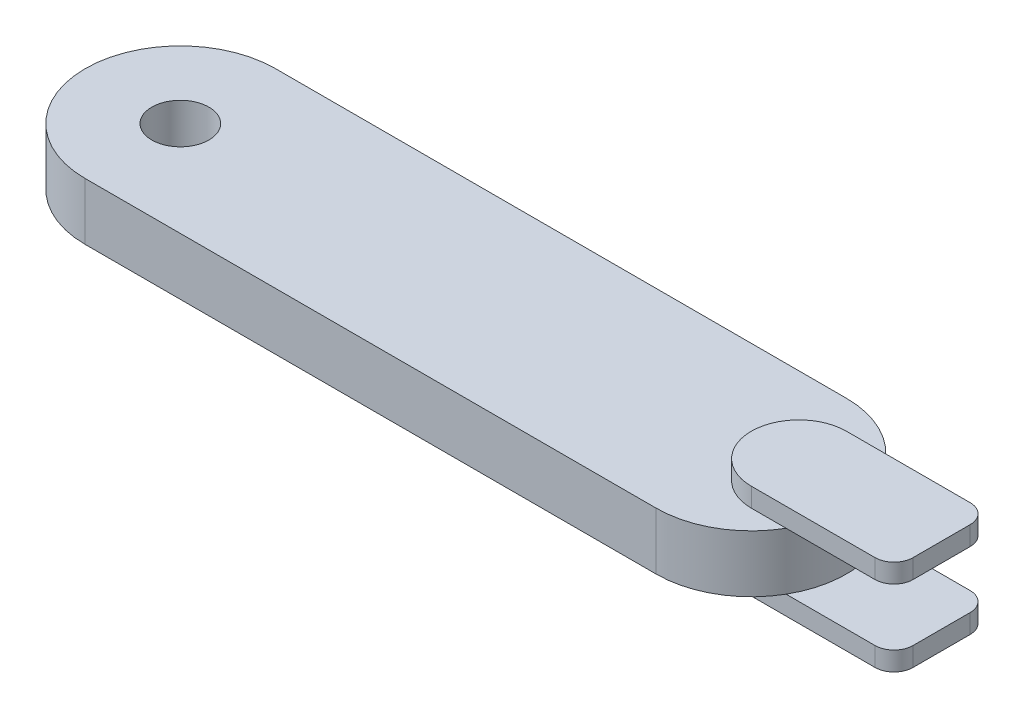
ISO-10303-21;
HEADER;
FILE_DESCRIPTION(('STEP AP214'),'2;1');
FILE_NAME('part.step','',(''),(''),'','','');
FILE_SCHEMA(('AUTOMOTIVE_DESIGN { 1 0 10303 214 1 1 1 1 }'));
ENDSEC;
DATA;
#1=APPLICATION_CONTEXT('core data for automotive mechanical design processes');
#2=APPLICATION_PROTOCOL_DEFINITION('international standard','automotive_design',2000,#1);
#3=PRODUCT_CONTEXT('',#1,'mechanical');
#4=PRODUCT('Part','Part','',(#3));
#5=PRODUCT_RELATED_PRODUCT_CATEGORY('part','',(#4));
#6=PRODUCT_DEFINITION_FORMATION('','',#4);
#7=PRODUCT_DEFINITION_CONTEXT('part definition',#1,'design');
#8=PRODUCT_DEFINITION('design','',#6,#7);
#9=PRODUCT_DEFINITION_SHAPE('','',#8);
#10=(LENGTH_UNIT() NAMED_UNIT(*) SI_UNIT(.MILLI.,.METRE.));
#11=(NAMED_UNIT(*) PLANE_ANGLE_UNIT() SI_UNIT($,.RADIAN.));
#12=(NAMED_UNIT(*) SI_UNIT($,.STERADIAN.) SOLID_ANGLE_UNIT());
#13=UNCERTAINTY_MEASURE_WITH_UNIT(LENGTH_MEASURE(1.E-05),#10,'distance_accuracy_value','');
#14=(GEOMETRIC_REPRESENTATION_CONTEXT(3) GLOBAL_UNCERTAINTY_ASSIGNED_CONTEXT((#13)) GLOBAL_UNIT_ASSIGNED_CONTEXT((#10,
#11,#12)) REPRESENTATION_CONTEXT('',''));
#15=CARTESIAN_POINT('',(0.,0.,0.));
#16=DIRECTION('',(0.,0.,1.));
#17=DIRECTION('',(1.,0.,0.));
#18=AXIS2_PLACEMENT_3D('',#15,#16,#17);
#19=CARTESIAN_POINT('',(0.,3.,0.));
#20=DIRECTION('',(0.,1.,0.));
#21=DIRECTION('',(0.,0.,1.));
#22=AXIS2_PLACEMENT_3D('',#19,#20,#21);
#23=PLANE('',#22);
#24=CARTESIAN_POINT('',(0.,3.,0.));
#25=DIRECTION('',(0.,1.,0.));
#26=DIRECTION('',(0.,0.,1.));
#27=AXIS2_PLACEMENT_3D('',#24,#25,#26);
#28=CIRCLE('',#27,1.5);
#29=CARTESIAN_POINT('',(0.,3.,1.5));
#30=VERTEX_POINT('',#29);
#31=EDGE_CURVE('E356',#30,#30,#28,.T.);
#32=ORIENTED_EDGE('',*,*,#31,.F.);
#33=EDGE_LOOP('',(#32));
#34=FACE_BOUND('',#33,.T.);
#35=DIRECTION('',(1.,0.,0.));
#36=VECTOR('',#35,1.);
#37=CARTESIAN_POINT('',(30.,3.,2.5));
#38=LINE('',#37,#36);
#39=CARTESIAN_POINT('',(32.5,3.,2.5));
#40=VERTEX_POINT('',#39);
#41=CARTESIAN_POINT('',(34.3301270189222,3.,2.5));
#42=VERTEX_POINT('',#41);
#43=EDGE_CURVE('E304',#40,#42,#38,.T.);
#44=ORIENTED_EDGE('',*,*,#43,.F.);
#45=CARTESIAN_POINT('',(32.5,3.,0.));
#46=DIRECTION('',(0.,1.,0.));
#47=DIRECTION('',(0.,0.,1.));
#48=AXIS2_PLACEMENT_3D('',#45,#46,#47);
#49=CIRCLE('',#48,2.5);
#50=CARTESIAN_POINT('',(30.,3.,0.));
#51=VERTEX_POINT('',#50);
#52=EDGE_CURVE('E257',#40,#51,#49,.F.);
#53=ORIENTED_EDGE('',*,*,#52,.T.);
#54=CARTESIAN_POINT('',(32.5,3.,0.));
#55=DIRECTION('',(0.,1.,0.));
#56=DIRECTION('',(0.,0.,1.));
#57=AXIS2_PLACEMENT_3D('',#54,#55,#56);
#58=CIRCLE('',#57,2.5);
#59=CARTESIAN_POINT('',(32.5,3.,-2.5));
#60=VERTEX_POINT('',#59);
#61=EDGE_CURVE('E178',#51,#60,#58,.F.);
#62=ORIENTED_EDGE('',*,*,#61,.T.);
#63=DIRECTION('',(1.,0.,0.));
#64=VECTOR('',#63,1.);
#65=CARTESIAN_POINT('',(30.,3.,-2.5));
#66=LINE('',#65,#64);
#67=CARTESIAN_POINT('',(34.3301270189222,3.,-2.5));
#68=VERTEX_POINT('',#67);
#69=EDGE_CURVE('E171',#60,#68,#66,.T.);
#70=ORIENTED_EDGE('',*,*,#69,.T.);
#71=CARTESIAN_POINT('',(30.,3.,0.));
#72=DIRECTION('',(0.,1.,0.));
#73=DIRECTION('',(0.,0.,1.));
#74=AXIS2_PLACEMENT_3D('',#71,#72,#73);
#75=CIRCLE('',#74,5.);
#76=CARTESIAN_POINT('',(30.,3.,-5.));
#77=VERTEX_POINT('',#76);
#78=EDGE_CURVE('E175',#68,#77,#75,.T.);
#79=ORIENTED_EDGE('',*,*,#78,.T.);
#80=DIRECTION('',(-1.,0.,0.));
#81=VECTOR('',#80,1.);
#82=CARTESIAN_POINT('',(0.,3.,-5.));
#83=LINE('',#82,#81);
#84=CARTESIAN_POINT('',(0.,3.,-5.));
#85=VERTEX_POINT('',#84);
#86=EDGE_CURVE('E206',#77,#85,#83,.T.);
#87=ORIENTED_EDGE('',*,*,#86,.T.);
#88=CARTESIAN_POINT('',(0.,3.,0.));
#89=DIRECTION('',(0.,1.,0.));
#90=DIRECTION('',(0.,0.,1.));
#91=AXIS2_PLACEMENT_3D('',#88,#89,#90);
#92=CIRCLE('',#91,5.);
#93=CARTESIAN_POINT('',(0.,3.,5.));
#94=VERTEX_POINT('',#93);
#95=EDGE_CURVE('E203',#85,#94,#92,.T.);
#96=ORIENTED_EDGE('',*,*,#95,.T.);
#97=DIRECTION('',(1.,0.,0.));
#98=VECTOR('',#97,1.);
#99=CARTESIAN_POINT('',(0.,3.,5.));
#100=LINE('',#99,#98);
#101=CARTESIAN_POINT('',(30.,3.,5.));
#102=VERTEX_POINT('',#101);
#103=EDGE_CURVE('E202',#94,#102,#100,.T.);
#104=ORIENTED_EDGE('',*,*,#103,.T.);
#105=EDGE_CURVE('E193',#102,#42,#75,.T.);
#106=ORIENTED_EDGE('',*,*,#105,.T.);
#107=EDGE_LOOP('',(#44,#53,#62,#70,#79,#87,#96,#104,#106));
#108=FACE_BOUND('',#107,.T.);
#109=ADVANCED_FACE('F33',(#34,#108),#23,.T.);
#110=CARTESIAN_POINT('',(0.,3.,0.));
#111=DIRECTION('',(0.,-1.,0.));
#112=DIRECTION('',(0.,0.,-1.));
#113=AXIS2_PLACEMENT_3D('',#110,#111,#112);
#114=CYLINDRICAL_SURFACE('',#113,5.);
#115=CARTESIAN_POINT('',(0.,0.,0.));
#116=DIRECTION('',(0.,1.,0.));
#117=DIRECTION('',(0.,0.,1.));
#118=AXIS2_PLACEMENT_3D('',#115,#116,#117);
#119=CIRCLE('',#118,5.);
#120=CARTESIAN_POINT('',(0.,0.,-5.));
#121=VERTEX_POINT('',#120);
#122=CARTESIAN_POINT('',(0.,0.,5.));
#123=VERTEX_POINT('',#122);
#124=EDGE_CURVE('E213',#121,#123,#119,.T.);
#125=ORIENTED_EDGE('',*,*,#124,.T.);
#126=DIRECTION('',(0.,-1.,0.));
#127=VECTOR('',#126,1.);
#128=CARTESIAN_POINT('',(0.,3.,5.));
#129=LINE('',#128,#127);
#130=EDGE_CURVE('E229',#94,#123,#129,.T.);
#131=ORIENTED_EDGE('',*,*,#130,.F.);
#132=ORIENTED_EDGE('',*,*,#95,.F.);
#133=DIRECTION('',(0.,-1.,0.));
#134=VECTOR('',#133,1.);
#135=CARTESIAN_POINT('',(0.,3.,-5.));
#136=LINE('',#135,#134);
#137=EDGE_CURVE('E207',#85,#121,#136,.T.);
#138=ORIENTED_EDGE('',*,*,#137,.T.);
#139=EDGE_LOOP('',(#125,#131,#132,#138));
#140=FACE_BOUND('',#139,.T.);
#141=ADVANCED_FACE('F325',(#140),#114,.T.);
#142=CARTESIAN_POINT('',(0.,3.,5.));
#143=DIRECTION('',(0.,0.,-1.));
#144=DIRECTION('',(-1.,0.,0.));
#145=AXIS2_PLACEMENT_3D('',#142,#143,#144);
#146=PLANE('',#145);
#147=DIRECTION('',(1.,0.,0.));
#148=VECTOR('',#147,1.);
#149=CARTESIAN_POINT('',(0.,0.,5.));
#150=LINE('',#149,#148);
#151=CARTESIAN_POINT('',(30.,0.,5.));
#152=VERTEX_POINT('',#151);
#153=EDGE_CURVE('E216',#123,#152,#150,.T.);
#154=ORIENTED_EDGE('',*,*,#153,.T.);
#155=DIRECTION('',(0.,-1.,0.));
#156=VECTOR('',#155,1.);
#157=CARTESIAN_POINT('',(30.,3.,5.));
#158=LINE('',#157,#156);
#159=EDGE_CURVE('E226',#102,#152,#158,.T.);
#160=ORIENTED_EDGE('',*,*,#159,.F.);
#161=ORIENTED_EDGE('',*,*,#103,.F.);
#162=ORIENTED_EDGE('',*,*,#130,.T.);
#163=EDGE_LOOP('',(#154,#160,#161,#162));
#164=FACE_BOUND('',#163,.T.);
#165=ADVANCED_FACE('F328',(#164),#146,.F.);
#166=CARTESIAN_POINT('',(30.,3.,0.));
#167=DIRECTION('',(0.,-1.,0.));
#168=DIRECTION('',(0.,0.,-1.));
#169=AXIS2_PLACEMENT_3D('',#166,#167,#168);
#170=CYLINDRICAL_SURFACE('',#169,5.);
#171=CARTESIAN_POINT('',(30.,0.,0.));
#172=DIRECTION('',(0.,1.,0.));
#173=DIRECTION('',(0.,0.,1.));
#174=AXIS2_PLACEMENT_3D('',#171,#172,#173);
#175=CIRCLE('',#174,5.);
#176=CARTESIAN_POINT('',(34.3301270189222,0.,2.5));
#177=VERTEX_POINT('',#176);
#178=EDGE_CURVE('E220',#152,#177,#175,.T.);
#179=ORIENTED_EDGE('',*,*,#178,.T.);
#180=CARTESIAN_POINT('',(34.3301270189222,0.,-2.5));
#181=VERTEX_POINT('',#180);
#182=EDGE_CURVE('E223',#177,#181,#175,.T.);
#183=ORIENTED_EDGE('',*,*,#182,.T.);
#184=CARTESIAN_POINT('',(30.,0.,-5.));
#185=VERTEX_POINT('',#184);
#186=EDGE_CURVE('E219',#181,#185,#175,.T.);
#187=ORIENTED_EDGE('',*,*,#186,.T.);
#188=DIRECTION('',(0.,-1.,0.));
#189=VECTOR('',#188,1.);
#190=CARTESIAN_POINT('',(30.,3.,-5.));
#191=LINE('',#190,#189);
#192=EDGE_CURVE('E200',#77,#185,#191,.T.);
#193=ORIENTED_EDGE('',*,*,#192,.F.);
#194=ORIENTED_EDGE('',*,*,#78,.F.);
#195=EDGE_CURVE('E186',#42,#68,#75,.T.);
#196=ORIENTED_EDGE('',*,*,#195,.F.);
#197=ORIENTED_EDGE('',*,*,#105,.F.);
#198=ORIENTED_EDGE('',*,*,#159,.T.);
#199=EDGE_LOOP('',(#179,#183,#187,#193,#194,#196,#197,#198));
#200=FACE_BOUND('',#199,.T.);
#201=ADVANCED_FACE('F198',(#200),#170,.T.);
#202=CARTESIAN_POINT('',(0.,3.,-5.));
#203=DIRECTION('',(0.,0.,1.));
#204=DIRECTION('',(1.,0.,0.));
#205=AXIS2_PLACEMENT_3D('',#202,#203,#204);
#206=PLANE('',#205);
#207=DIRECTION('',(-1.,0.,0.));
#208=VECTOR('',#207,1.);
#209=CARTESIAN_POINT('',(0.,0.,-5.));
#210=LINE('',#209,#208);
#211=EDGE_CURVE('E222',#185,#121,#210,.T.);
#212=ORIENTED_EDGE('',*,*,#211,.T.);
#213=ORIENTED_EDGE('',*,*,#137,.F.);
#214=ORIENTED_EDGE('',*,*,#86,.F.);
#215=ORIENTED_EDGE('',*,*,#192,.T.);
#216=EDGE_LOOP('',(#212,#213,#214,#215));
#217=FACE_BOUND('',#216,.T.);
#218=ADVANCED_FACE('F384',(#217),#206,.F.);
#219=CARTESIAN_POINT('',(0.,0.,0.));
#220=DIRECTION('',(0.,1.,0.));
#221=DIRECTION('',(0.,0.,1.));
#222=AXIS2_PLACEMENT_3D('',#219,#220,#221);
#223=PLANE('',#222);
#224=CARTESIAN_POINT('',(0.,0.,0.));
#225=DIRECTION('',(0.,1.,0.));
#226=DIRECTION('',(0.,0.,1.));
#227=AXIS2_PLACEMENT_3D('',#224,#225,#226);
#228=CIRCLE('',#227,1.5);
#229=CARTESIAN_POINT('',(0.,0.,1.5));
#230=VERTEX_POINT('',#229);
#231=EDGE_CURVE('E37',#230,#230,#228,.T.);
#232=ORIENTED_EDGE('',*,*,#231,.T.);
#233=EDGE_LOOP('',(#232));
#234=FACE_BOUND('',#233,.T.);
#235=ORIENTED_EDGE('',*,*,#186,.F.);
#236=DIRECTION('',(-1.,0.,0.));
#237=VECTOR('',#236,1.);
#238=CARTESIAN_POINT('',(30.,0.,-2.5));
#239=LINE('',#238,#237);
#240=CARTESIAN_POINT('',(32.5,0.,-2.5));
#241=VERTEX_POINT('',#240);
#242=EDGE_CURVE('E237',#181,#241,#239,.T.);
#243=ORIENTED_EDGE('',*,*,#242,.T.);
#244=CARTESIAN_POINT('',(32.5,0.,0.));
#245=DIRECTION('',(0.,1.,0.));
#246=DIRECTION('',(0.,0.,1.));
#247=AXIS2_PLACEMENT_3D('',#244,#245,#246);
#248=CIRCLE('',#247,2.5);
#249=CARTESIAN_POINT('',(30.,0.,0.));
#250=VERTEX_POINT('',#249);
#251=EDGE_CURVE('E254',#241,#250,#248,.T.);
#252=ORIENTED_EDGE('',*,*,#251,.T.);
#253=CARTESIAN_POINT('',(32.5,0.,0.));
#254=DIRECTION('',(0.,1.,0.));
#255=DIRECTION('',(0.,0.,1.));
#256=AXIS2_PLACEMENT_3D('',#253,#254,#255);
#257=CIRCLE('',#256,2.5);
#258=CARTESIAN_POINT('',(32.5,0.,2.5));
#259=VERTEX_POINT('',#258);
#260=EDGE_CURVE('E252',#250,#259,#257,.T.);
#261=ORIENTED_EDGE('',*,*,#260,.T.);
#262=DIRECTION('',(-1.,0.,0.));
#263=VECTOR('',#262,1.);
#264=CARTESIAN_POINT('',(30.,0.,2.5));
#265=LINE('',#264,#263);
#266=EDGE_CURVE('E232',#177,#259,#265,.T.);
#267=ORIENTED_EDGE('',*,*,#266,.F.);
#268=ORIENTED_EDGE('',*,*,#178,.F.);
#269=ORIENTED_EDGE('',*,*,#153,.F.);
#270=ORIENTED_EDGE('',*,*,#124,.F.);
#271=ORIENTED_EDGE('',*,*,#211,.F.);
#272=EDGE_LOOP('',(#235,#243,#252,#261,#267,#268,#269,#270,#271));
#273=FACE_BOUND('',#272,.T.);
#274=ADVANCED_FACE('F335',(#234,#273),#223,.F.);
#275=CARTESIAN_POINT('',(30.,3.,2.5));
#276=DIRECTION('',(0.,1.,0.));
#277=DIRECTION('',(0.,0.,1.));
#278=AXIS2_PLACEMENT_3D('',#275,#276,#277);
#279=PLANE('',#278);
#280=DIRECTION('',(0.,0.,-1.));
#281=VECTOR('',#280,1.);
#282=CARTESIAN_POINT('',(40.,3.,2.5));
#283=LINE('',#282,#281);
#284=CARTESIAN_POINT('',(40.,3.,1.5));
#285=VERTEX_POINT('',#284);
#286=CARTESIAN_POINT('',(40.,3.,-1.5));
#287=VERTEX_POINT('',#286);
#288=EDGE_CURVE('E217',#285,#287,#283,.T.);
#289=ORIENTED_EDGE('',*,*,#288,.F.);
#290=CARTESIAN_POINT('',(39.,3.,1.5));
#291=DIRECTION('',(0.,1.,0.));
#292=DIRECTION('',(0.,0.,1.));
#293=AXIS2_PLACEMENT_3D('',#290,#291,#292);
#294=CIRCLE('',#293,1.);
#295=CARTESIAN_POINT('',(39.,3.,2.5));
#296=VERTEX_POINT('',#295);
#297=EDGE_CURVE('E42',#285,#296,#294,.F.);
#298=ORIENTED_EDGE('',*,*,#297,.T.);
#299=EDGE_CURVE('E189',#42,#296,#38,.T.);
#300=ORIENTED_EDGE('',*,*,#299,.F.);
#301=ORIENTED_EDGE('',*,*,#195,.T.);
#302=CARTESIAN_POINT('',(39.,3.,-2.5));
#303=VERTEX_POINT('',#302);
#304=EDGE_CURVE('E182',#68,#303,#66,.T.);
#305=ORIENTED_EDGE('',*,*,#304,.T.);
#306=CARTESIAN_POINT('',(39.,3.,-1.5));
#307=DIRECTION('',(0.,1.,0.));
#308=DIRECTION('',(0.,0.,1.));
#309=AXIS2_PLACEMENT_3D('',#306,#307,#308);
#310=CIRCLE('',#309,1.);
#311=EDGE_CURVE('E54',#303,#287,#310,.F.);
#312=ORIENTED_EDGE('',*,*,#311,.T.);
#313=EDGE_LOOP('',(#289,#298,#300,#301,#305,#312));
#314=FACE_BOUND('',#313,.T.);
#315=ADVANCED_FACE('F187',(#314),#279,.F.);
#316=CARTESIAN_POINT('',(40.,3.,2.5));
#317=DIRECTION('',(-1.,0.,0.));
#318=DIRECTION('',(0.,0.,1.));
#319=AXIS2_PLACEMENT_3D('',#316,#317,#318);
#320=PLANE('',#319);
#321=DIRECTION('',(0.,0.,-1.));
#322=VECTOR('',#321,1.);
#323=CARTESIAN_POINT('',(40.,4.,2.5));
#324=LINE('',#323,#322);
#325=CARTESIAN_POINT('',(40.,4.,1.5));
#326=VERTEX_POINT('',#325);
#327=CARTESIAN_POINT('',(40.,4.,-1.5));
#328=VERTEX_POINT('',#327);
#329=EDGE_CURVE('E311',#326,#328,#324,.T.);
#330=ORIENTED_EDGE('',*,*,#329,.F.);
#331=DIRECTION('',(0.,1.,0.));
#332=VECTOR('',#331,1.);
#333=CARTESIAN_POINT('',(40.,3.,1.5));
#334=LINE('',#333,#332);
#335=EDGE_CURVE('E294',#326,#285,#334,.F.);
#336=ORIENTED_EDGE('',*,*,#335,.T.);
#337=ORIENTED_EDGE('',*,*,#288,.T.);
#338=DIRECTION('',(0.,1.,0.));
#339=VECTOR('',#338,1.);
#340=CARTESIAN_POINT('',(40.,4.,-1.5));
#341=LINE('',#340,#339);
#342=EDGE_CURVE('E291',#287,#328,#341,.T.);
#343=ORIENTED_EDGE('',*,*,#342,.T.);
#344=EDGE_LOOP('',(#330,#336,#337,#343));
#345=FACE_BOUND('',#344,.T.);
#346=ADVANCED_FACE('F314',(#345),#320,.F.);
#347=CARTESIAN_POINT('',(30.,4.,2.5));
#348=DIRECTION('',(0.,-1.,0.));
#349=DIRECTION('',(0.,0.,-1.));
#350=AXIS2_PLACEMENT_3D('',#347,#348,#349);
#351=PLANE('',#350);
#352=DIRECTION('',(-1.,0.,0.));
#353=VECTOR('',#352,1.);
#354=CARTESIAN_POINT('',(30.,4.,2.5));
#355=LINE('',#354,#353);
#356=CARTESIAN_POINT('',(39.,4.,2.5));
#357=VERTEX_POINT('',#356);
#358=CARTESIAN_POINT('',(32.5,4.,2.5));
#359=VERTEX_POINT('',#358);
#360=EDGE_CURVE('E312',#357,#359,#355,.T.);
#361=ORIENTED_EDGE('',*,*,#360,.F.);
#362=CARTESIAN_POINT('',(39.,4.,1.5));
#363=DIRECTION('',(0.,-1.,0.));
#364=DIRECTION('',(0.,0.,-1.));
#365=AXIS2_PLACEMENT_3D('',#362,#363,#364);
#366=CIRCLE('',#365,1.);
#367=EDGE_CURVE('E289',#357,#326,#366,.F.);
#368=ORIENTED_EDGE('',*,*,#367,.T.);
#369=ORIENTED_EDGE('',*,*,#329,.T.);
#370=CARTESIAN_POINT('',(39.,4.,-1.5));
#371=DIRECTION('',(0.,-1.,0.));
#372=DIRECTION('',(0.,0.,-1.));
#373=AXIS2_PLACEMENT_3D('',#370,#371,#372);
#374=CIRCLE('',#373,1.);
#375=CARTESIAN_POINT('',(39.,4.,-2.5));
#376=VERTEX_POINT('',#375);
#377=EDGE_CURVE('E287',#328,#376,#374,.F.);
#378=ORIENTED_EDGE('',*,*,#377,.T.);
#379=DIRECTION('',(-1.,0.,0.));
#380=VECTOR('',#379,1.);
#381=CARTESIAN_POINT('',(30.,4.,-2.5));
#382=LINE('',#381,#380);
#383=CARTESIAN_POINT('',(32.5,4.,-2.5));
#384=VERTEX_POINT('',#383);
#385=EDGE_CURVE('E181',#376,#384,#382,.T.);
#386=ORIENTED_EDGE('',*,*,#385,.T.);
#387=CARTESIAN_POINT('',(32.5,4.,0.));
#388=DIRECTION('',(0.,-1.,0.));
#389=DIRECTION('',(0.,0.,-1.));
#390=AXIS2_PLACEMENT_3D('',#387,#388,#389);
#391=CIRCLE('',#390,2.5);
#392=CARTESIAN_POINT('',(30.,4.,0.));
#393=VERTEX_POINT('',#392);
#394=EDGE_CURVE('E248',#384,#393,#391,.F.);
#395=ORIENTED_EDGE('',*,*,#394,.T.);
#396=CARTESIAN_POINT('',(32.5,4.,0.));
#397=DIRECTION('',(0.,-1.,0.));
#398=DIRECTION('',(0.,0.,-1.));
#399=AXIS2_PLACEMENT_3D('',#396,#397,#398);
#400=CIRCLE('',#399,2.5);
#401=EDGE_CURVE('E245',#393,#359,#400,.F.);
#402=ORIENTED_EDGE('',*,*,#401,.T.);
#403=EDGE_LOOP('',(#361,#368,#369,#378,#386,#395,#402));
#404=FACE_BOUND('',#403,.T.);
#405=ADVANCED_FACE('F310',(#404),#351,.F.);
#406=CARTESIAN_POINT('',(0.,0.,2.5));
#407=DIRECTION('',(0.,0.,-1.));
#408=DIRECTION('',(-1.,0.,0.));
#409=AXIS2_PLACEMENT_3D('',#406,#407,#408);
#410=PLANE('',#409);
#411=ORIENTED_EDGE('',*,*,#299,.T.);
#412=DIRECTION('',(0.,1.,0.));
#413=VECTOR('',#412,1.);
#414=CARTESIAN_POINT('',(39.,0.,2.5));
#415=LINE('',#414,#413);
#416=EDGE_CURVE('E284',#296,#357,#415,.T.);
#417=ORIENTED_EDGE('',*,*,#416,.T.);
#418=ORIENTED_EDGE('',*,*,#360,.T.);
#419=DIRECTION('',(0.,-1.,0.));
#420=VECTOR('',#419,1.);
#421=CARTESIAN_POINT('',(32.5,0.,2.5));
#422=LINE('',#421,#420);
#423=EDGE_CURVE('E250',#359,#40,#422,.T.);
#424=ORIENTED_EDGE('',*,*,#423,.T.);
#425=ORIENTED_EDGE('',*,*,#43,.T.);
#426=EDGE_LOOP('',(#411,#417,#418,#424,#425));
#427=FACE_BOUND('',#426,.T.);
#428=ADVANCED_FACE('F302',(#427),#410,.F.);
#429=CARTESIAN_POINT('',(0.,0.,-2.5));
#430=DIRECTION('',(0.,0.,-1.));
#431=DIRECTION('',(-1.,0.,0.));
#432=AXIS2_PLACEMENT_3D('',#429,#430,#431);
#433=PLANE('',#432);
#434=ORIENTED_EDGE('',*,*,#385,.F.);
#435=DIRECTION('',(0.,1.,0.));
#436=VECTOR('',#435,1.);
#437=CARTESIAN_POINT('',(39.,3.,-2.5));
#438=LINE('',#437,#436);
#439=EDGE_CURVE('E11',#376,#303,#438,.F.);
#440=ORIENTED_EDGE('',*,*,#439,.T.);
#441=ORIENTED_EDGE('',*,*,#304,.F.);
#442=ORIENTED_EDGE('',*,*,#69,.F.);
#443=DIRECTION('',(0.,-1.,0.));
#444=VECTOR('',#443,1.);
#445=CARTESIAN_POINT('',(32.5,4.,-2.5));
#446=LINE('',#445,#444);
#447=EDGE_CURVE('E243',#60,#384,#446,.F.);
#448=ORIENTED_EDGE('',*,*,#447,.T.);
#449=EDGE_LOOP('',(#434,#440,#441,#442,#448));
#450=FACE_BOUND('',#449,.T.);
#451=ADVANCED_FACE('F195',(#450),#433,.T.);
#452=CARTESIAN_POINT('',(30.,-1.,2.5));
#453=DIRECTION('',(0.,1.,0.));
#454=DIRECTION('',(0.,0.,1.));
#455=AXIS2_PLACEMENT_3D('',#452,#453,#454);
#456=PLANE('',#455);
#457=DIRECTION('',(1.,0.,0.));
#458=VECTOR('',#457,1.);
#459=CARTESIAN_POINT('',(30.,-1.,-2.5));
#460=LINE('',#459,#458);
#461=CARTESIAN_POINT('',(32.5,-1.,-2.5));
#462=VERTEX_POINT('',#461);
#463=CARTESIAN_POINT('',(39.,-1.,-2.5));
#464=VERTEX_POINT('',#463);
#465=EDGE_CURVE('E263',#462,#464,#460,.T.);
#466=ORIENTED_EDGE('',*,*,#465,.T.);
#467=CARTESIAN_POINT('',(39.,-1.,-1.5));
#468=DIRECTION('',(0.,1.,0.));
#469=DIRECTION('',(0.,0.,1.));
#470=AXIS2_PLACEMENT_3D('',#467,#468,#469);
#471=CIRCLE('',#470,1.);
#472=CARTESIAN_POINT('',(40.,-1.,-1.5));
#473=VERTEX_POINT('',#472);
#474=EDGE_CURVE('E279',#464,#473,#471,.F.);
#475=ORIENTED_EDGE('',*,*,#474,.T.);
#476=DIRECTION('',(0.,0.,-1.));
#477=VECTOR('',#476,1.);
#478=CARTESIAN_POINT('',(40.,-1.,2.5));
#479=LINE('',#478,#477);
#480=CARTESIAN_POINT('',(40.,-1.,1.5));
#481=VERTEX_POINT('',#480);
#482=EDGE_CURVE('E196',#481,#473,#479,.T.);
#483=ORIENTED_EDGE('',*,*,#482,.F.);
#484=CARTESIAN_POINT('',(39.,-1.,1.5));
#485=DIRECTION('',(0.,1.,0.));
#486=DIRECTION('',(0.,0.,1.));
#487=AXIS2_PLACEMENT_3D('',#484,#485,#486);
#488=CIRCLE('',#487,1.);
#489=CARTESIAN_POINT('',(39.,-1.,2.5));
#490=VERTEX_POINT('',#489);
#491=EDGE_CURVE('E277',#481,#490,#488,.F.);
#492=ORIENTED_EDGE('',*,*,#491,.T.);
#493=DIRECTION('',(1.,0.,0.));
#494=VECTOR('',#493,1.);
#495=CARTESIAN_POINT('',(30.,-1.,2.5));
#496=LINE('',#495,#494);
#497=CARTESIAN_POINT('',(32.5,-1.,2.5));
#498=VERTEX_POINT('',#497);
#499=EDGE_CURVE('E348',#498,#490,#496,.T.);
#500=ORIENTED_EDGE('',*,*,#499,.F.);
#501=CARTESIAN_POINT('',(32.5,-1.,0.));
#502=DIRECTION('',(0.,1.,0.));
#503=DIRECTION('',(0.,0.,1.));
#504=AXIS2_PLACEMENT_3D('',#501,#502,#503);
#505=CIRCLE('',#504,2.5);
#506=CARTESIAN_POINT('',(30.,-1.,0.));
#507=VERTEX_POINT('',#506);
#508=EDGE_CURVE('E239',#498,#507,#505,.F.);
#509=ORIENTED_EDGE('',*,*,#508,.T.);
#510=CARTESIAN_POINT('',(32.5,-1.,0.));
#511=DIRECTION('',(0.,1.,0.));
#512=DIRECTION('',(0.,0.,1.));
#513=AXIS2_PLACEMENT_3D('',#510,#511,#512);
#514=CIRCLE('',#513,2.5);
#515=EDGE_CURVE('E236',#507,#462,#514,.F.);
#516=ORIENTED_EDGE('',*,*,#515,.T.);
#517=EDGE_LOOP('',(#466,#475,#483,#492,#500,#509,#516));
#518=FACE_BOUND('',#517,.T.);
#519=ADVANCED_FACE('F473',(#518),#456,.F.);
#520=CARTESIAN_POINT('',(40.,0.,2.5));
#521=DIRECTION('',(-1.,0.,0.));
#522=DIRECTION('',(0.,0.,1.));
#523=AXIS2_PLACEMENT_3D('',#520,#521,#522);
#524=PLANE('',#523);
#525=ORIENTED_EDGE('',*,*,#482,.T.);
#526=DIRECTION('',(0.,1.,0.));
#527=VECTOR('',#526,1.);
#528=CARTESIAN_POINT('',(40.,0.,-1.5));
#529=LINE('',#528,#527);
#530=CARTESIAN_POINT('',(40.,0.,-1.5));
#531=VERTEX_POINT('',#530);
#532=EDGE_CURVE('E268',#473,#531,#529,.T.);
#533=ORIENTED_EDGE('',*,*,#532,.T.);
#534=DIRECTION('',(0.,0.,-1.));
#535=VECTOR('',#534,1.);
#536=CARTESIAN_POINT('',(40.,0.,2.5));
#537=LINE('',#536,#535);
#538=CARTESIAN_POINT('',(40.,0.,1.5));
#539=VERTEX_POINT('',#538);
#540=EDGE_CURVE('E347',#539,#531,#537,.T.);
#541=ORIENTED_EDGE('',*,*,#540,.F.);
#542=DIRECTION('',(0.,1.,0.));
#543=VECTOR('',#542,1.);
#544=CARTESIAN_POINT('',(40.,-1.,1.5));
#545=LINE('',#544,#543);
#546=EDGE_CURVE('E259',#539,#481,#545,.F.);
#547=ORIENTED_EDGE('',*,*,#546,.T.);
#548=EDGE_LOOP('',(#525,#533,#541,#547));
#549=FACE_BOUND('',#548,.T.);
#550=ADVANCED_FACE('F480',(#549),#524,.F.);
#551=CARTESIAN_POINT('',(30.,0.,2.5));
#552=DIRECTION('',(0.,-1.,0.));
#553=DIRECTION('',(0.,0.,-1.));
#554=AXIS2_PLACEMENT_3D('',#551,#552,#553);
#555=PLANE('',#554);
#556=ORIENTED_EDGE('',*,*,#540,.T.);
#557=CARTESIAN_POINT('',(39.,0.,-1.5));
#558=DIRECTION('',(0.,-1.,0.));
#559=DIRECTION('',(0.,0.,-1.));
#560=AXIS2_PLACEMENT_3D('',#557,#558,#559);
#561=CIRCLE('',#560,1.);
#562=CARTESIAN_POINT('',(39.,0.,-2.5));
#563=VERTEX_POINT('',#562);
#564=EDGE_CURVE('E273',#531,#563,#561,.F.);
#565=ORIENTED_EDGE('',*,*,#564,.T.);
#566=EDGE_CURVE('E344',#563,#181,#239,.T.);
#567=ORIENTED_EDGE('',*,*,#566,.T.);
#568=ORIENTED_EDGE('',*,*,#182,.F.);
#569=CARTESIAN_POINT('',(39.,0.,2.5));
#570=VERTEX_POINT('',#569);
#571=EDGE_CURVE('E341',#570,#177,#265,.T.);
#572=ORIENTED_EDGE('',*,*,#571,.F.);
#573=CARTESIAN_POINT('',(39.,0.,1.5));
#574=DIRECTION('',(0.,-1.,0.));
#575=DIRECTION('',(0.,0.,-1.));
#576=AXIS2_PLACEMENT_3D('',#573,#574,#575);
#577=CIRCLE('',#576,1.);
#578=EDGE_CURVE('E271',#570,#539,#577,.F.);
#579=ORIENTED_EDGE('',*,*,#578,.T.);
#580=EDGE_LOOP('',(#556,#565,#567,#568,#572,#579));
#581=FACE_BOUND('',#580,.T.);
#582=ADVANCED_FACE('F488',(#581),#555,.F.);
#583=CARTESIAN_POINT('',(0.,0.,2.5));
#584=DIRECTION('',(0.,0.,1.));
#585=DIRECTION('',(1.,0.,0.));
#586=AXIS2_PLACEMENT_3D('',#583,#584,#585);
#587=PLANE('',#586);
#588=ORIENTED_EDGE('',*,*,#499,.T.);
#589=DIRECTION('',(0.,1.,0.));
#590=VECTOR('',#589,1.);
#591=CARTESIAN_POINT('',(39.,0.,2.5));
#592=LINE('',#591,#590);
#593=EDGE_CURVE('E281',#490,#570,#592,.T.);
#594=ORIENTED_EDGE('',*,*,#593,.T.);
#595=ORIENTED_EDGE('',*,*,#571,.T.);
#596=ORIENTED_EDGE('',*,*,#266,.T.);
#597=DIRECTION('',(0.,-1.,0.));
#598=VECTOR('',#597,1.);
#599=CARTESIAN_POINT('',(32.5,-1.,2.5));
#600=LINE('',#599,#598);
#601=EDGE_CURVE('E233',#259,#498,#600,.T.);
#602=ORIENTED_EDGE('',*,*,#601,.T.);
#603=EDGE_LOOP('',(#588,#594,#595,#596,#602));
#604=FACE_BOUND('',#603,.T.);
#605=ADVANCED_FACE('F496',(#604),#587,.T.);
#606=CARTESIAN_POINT('',(0.,0.,-2.5));
#607=DIRECTION('',(0.,0.,1.));
#608=DIRECTION('',(1.,0.,0.));
#609=AXIS2_PLACEMENT_3D('',#606,#607,#608);
#610=PLANE('',#609);
#611=ORIENTED_EDGE('',*,*,#566,.F.);
#612=DIRECTION('',(0.,1.,0.));
#613=VECTOR('',#612,1.);
#614=CARTESIAN_POINT('',(39.,0.,-2.5));
#615=LINE('',#614,#613);
#616=EDGE_CURVE('E275',#563,#464,#615,.F.);
#617=ORIENTED_EDGE('',*,*,#616,.T.);
#618=ORIENTED_EDGE('',*,*,#465,.F.);
#619=DIRECTION('',(0.,-1.,0.));
#620=VECTOR('',#619,1.);
#621=CARTESIAN_POINT('',(32.5,0.,-2.5));
#622=LINE('',#621,#620);
#623=EDGE_CURVE('E241',#462,#241,#622,.F.);
#624=ORIENTED_EDGE('',*,*,#623,.T.);
#625=ORIENTED_EDGE('',*,*,#242,.F.);
#626=EDGE_LOOP('',(#611,#617,#618,#624,#625));
#627=FACE_BOUND('',#626,.T.);
#628=ADVANCED_FACE('F400',(#627),#610,.F.);
#629=CARTESIAN_POINT('',(32.5,0.,0.));
#630=DIRECTION('',(0.,-1.,0.));
#631=DIRECTION('',(0.,0.,-1.));
#632=AXIS2_PLACEMENT_3D('',#629,#630,#631);
#633=CYLINDRICAL_SURFACE('',#632,2.5);
#634=DIRECTION('',(0.,-1.,0.));
#635=VECTOR('',#634,1.);
#636=CARTESIAN_POINT('',(30.,0.,0.));
#637=LINE('',#636,#635);
#638=EDGE_CURVE('E260',#250,#507,#637,.T.);
#639=ORIENTED_EDGE('',*,*,#638,.F.);
#640=ORIENTED_EDGE('',*,*,#251,.F.);
#641=ORIENTED_EDGE('',*,*,#623,.F.);
#642=ORIENTED_EDGE('',*,*,#515,.F.);
#643=EDGE_LOOP('',(#639,#640,#641,#642));
#644=FACE_BOUND('',#643,.T.);
#645=ADVANCED_FACE('F396',(#644),#633,.T.);
#646=CARTESIAN_POINT('',(32.5,0.,0.));
#647=DIRECTION('',(0.,1.,0.));
#648=DIRECTION('',(0.,0.,1.));
#649=AXIS2_PLACEMENT_3D('',#646,#647,#648);
#650=CYLINDRICAL_SURFACE('',#649,2.5);
#651=ORIENTED_EDGE('',*,*,#260,.F.);
#652=ORIENTED_EDGE('',*,*,#638,.T.);
#653=ORIENTED_EDGE('',*,*,#508,.F.);
#654=ORIENTED_EDGE('',*,*,#601,.F.);
#655=EDGE_LOOP('',(#651,#652,#653,#654));
#656=FACE_BOUND('',#655,.T.);
#657=ADVANCED_FACE('F392',(#656),#650,.T.);
#658=CARTESIAN_POINT('',(32.5,0.,0.));
#659=DIRECTION('',(0.,-1.,0.));
#660=DIRECTION('',(0.,0.,-1.));
#661=AXIS2_PLACEMENT_3D('',#658,#659,#660);
#662=CYLINDRICAL_SURFACE('',#661,2.5);
#663=ORIENTED_EDGE('',*,*,#423,.F.);
#664=ORIENTED_EDGE('',*,*,#401,.F.);
#665=DIRECTION('',(0.,-1.,0.));
#666=VECTOR('',#665,1.);
#667=CARTESIAN_POINT('',(30.,3.,0.));
#668=LINE('',#667,#666);
#669=EDGE_CURVE('E264',#51,#393,#668,.F.);
#670=ORIENTED_EDGE('',*,*,#669,.F.);
#671=ORIENTED_EDGE('',*,*,#52,.F.);
#672=EDGE_LOOP('',(#663,#664,#670,#671));
#673=FACE_BOUND('',#672,.T.);
#674=ADVANCED_FACE('F395',(#673),#662,.T.);
#675=CARTESIAN_POINT('',(32.5,3.,0.));
#676=DIRECTION('',(0.,1.,0.));
#677=DIRECTION('',(0.,0.,1.));
#678=AXIS2_PLACEMENT_3D('',#675,#676,#677);
#679=CYLINDRICAL_SURFACE('',#678,2.5);
#680=ORIENTED_EDGE('',*,*,#394,.F.);
#681=ORIENTED_EDGE('',*,*,#447,.F.);
#682=ORIENTED_EDGE('',*,*,#61,.F.);
#683=ORIENTED_EDGE('',*,*,#669,.T.);
#684=EDGE_LOOP('',(#680,#681,#682,#683));
#685=FACE_BOUND('',#684,.T.);
#686=ADVANCED_FACE('F402',(#685),#679,.T.);
#687=CARTESIAN_POINT('',(39.,0.,-1.5));
#688=DIRECTION('',(0.,1.,0.));
#689=DIRECTION('',(0.,0.,1.));
#690=AXIS2_PLACEMENT_3D('',#687,#688,#689);
#691=CYLINDRICAL_SURFACE('',#690,1.);
#692=ORIENTED_EDGE('',*,*,#474,.F.);
#693=ORIENTED_EDGE('',*,*,#616,.F.);
#694=ORIENTED_EDGE('',*,*,#564,.F.);
#695=ORIENTED_EDGE('',*,*,#532,.F.);
#696=EDGE_LOOP('',(#692,#693,#694,#695));
#697=FACE_BOUND('',#696,.T.);
#698=ADVANCED_FACE('F405',(#697),#691,.T.);
#699=CARTESIAN_POINT('',(39.,0.,1.5));
#700=DIRECTION('',(0.,-1.,0.));
#701=DIRECTION('',(0.,0.,-1.));
#702=AXIS2_PLACEMENT_3D('',#699,#700,#701);
#703=CYLINDRICAL_SURFACE('',#702,1.);
#704=ORIENTED_EDGE('',*,*,#491,.F.);
#705=ORIENTED_EDGE('',*,*,#546,.F.);
#706=ORIENTED_EDGE('',*,*,#578,.F.);
#707=ORIENTED_EDGE('',*,*,#593,.F.);
#708=EDGE_LOOP('',(#704,#705,#706,#707));
#709=FACE_BOUND('',#708,.T.);
#710=ADVANCED_FACE('F412',(#709),#703,.T.);
#711=CARTESIAN_POINT('',(39.,0.,1.5));
#712=DIRECTION('',(0.,1.,0.));
#713=DIRECTION('',(0.,0.,1.));
#714=AXIS2_PLACEMENT_3D('',#711,#712,#713);
#715=CYLINDRICAL_SURFACE('',#714,1.);
#716=ORIENTED_EDGE('',*,*,#297,.F.);
#717=ORIENTED_EDGE('',*,*,#335,.F.);
#718=ORIENTED_EDGE('',*,*,#367,.F.);
#719=ORIENTED_EDGE('',*,*,#416,.F.);
#720=EDGE_LOOP('',(#716,#717,#718,#719));
#721=FACE_BOUND('',#720,.T.);
#722=ADVANCED_FACE('F306',(#721),#715,.T.);
#723=CARTESIAN_POINT('',(39.,3.,-1.5));
#724=DIRECTION('',(0.,-1.,0.));
#725=DIRECTION('',(0.,0.,-1.));
#726=AXIS2_PLACEMENT_3D('',#723,#724,#725);
#727=CYLINDRICAL_SURFACE('',#726,1.);
#728=ORIENTED_EDGE('',*,*,#311,.F.);
#729=ORIENTED_EDGE('',*,*,#439,.F.);
#730=ORIENTED_EDGE('',*,*,#377,.F.);
#731=ORIENTED_EDGE('',*,*,#342,.F.);
#732=EDGE_LOOP('',(#728,#729,#730,#731));
#733=FACE_BOUND('',#732,.T.);
#734=ADVANCED_FACE('F35',(#733),#727,.T.);
#735=CARTESIAN_POINT('',(0.,-1.,0.));
#736=DIRECTION('',(0.,1.,0.));
#737=DIRECTION('',(0.,0.,1.));
#738=AXIS2_PLACEMENT_3D('',#735,#736,#737);
#739=CYLINDRICAL_SURFACE('',#738,1.5);
#740=ORIENTED_EDGE('',*,*,#31,.T.);
#741=EDGE_LOOP('',(#740));
#742=FACE_BOUND('',#741,.T.);
#743=ORIENTED_EDGE('',*,*,#231,.F.);
#744=EDGE_LOOP('',(#743));
#745=FACE_BOUND('',#744,.T.);
#746=ADVANCED_FACE('F364',(#742,#745),#739,.F.);
#747=CLOSED_SHELL('',(#109,#141,#165,#201,#218,#274,#315,#346,#405,#428,#451,#519,#550,#582,
#605,#628,#645,#657,#674,#686,#698,#710,#722,#734,#746));
#748=MANIFOLD_SOLID_BREP('B2',#747);
#749=ADVANCED_BREP_SHAPE_REPRESENTATION('',(#18,#748),#14);
#750=SHAPE_DEFINITION_REPRESENTATION(#9,#749);
ENDSEC;
END-ISO-10303-21;
